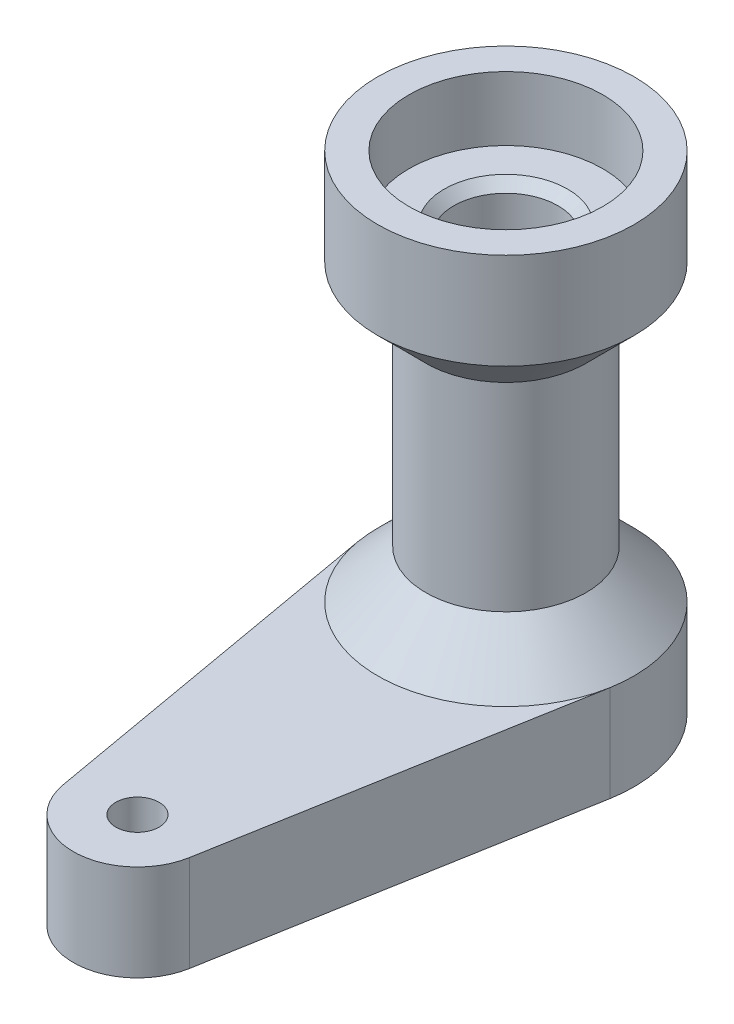
ISO-10303-21;
HEADER;
FILE_DESCRIPTION(('STEP AP214'),'2;1');
FILE_NAME('part.step','',(''),(''),'','','');
FILE_SCHEMA(('AUTOMOTIVE_DESIGN { 1 0 10303 214 1 1 1 1 }'));
ENDSEC;
DATA;
#1=APPLICATION_CONTEXT('core data for automotive mechanical design processes');
#2=APPLICATION_PROTOCOL_DEFINITION('international standard','automotive_design',2000,#1);
#3=PRODUCT_CONTEXT('',#1,'mechanical');
#4=PRODUCT('Part','Part','',(#3));
#5=PRODUCT_RELATED_PRODUCT_CATEGORY('part','',(#4));
#6=PRODUCT_DEFINITION_FORMATION('','',#4);
#7=PRODUCT_DEFINITION_CONTEXT('part definition',#1,'design');
#8=PRODUCT_DEFINITION('design','',#6,#7);
#9=PRODUCT_DEFINITION_SHAPE('','',#8);
#10=(LENGTH_UNIT() NAMED_UNIT(*) SI_UNIT(.MILLI.,.METRE.));
#11=(NAMED_UNIT(*) PLANE_ANGLE_UNIT() SI_UNIT($,.RADIAN.));
#12=(NAMED_UNIT(*) SI_UNIT($,.STERADIAN.) SOLID_ANGLE_UNIT());
#13=UNCERTAINTY_MEASURE_WITH_UNIT(LENGTH_MEASURE(1.E-05),#10,'distance_accuracy_value','');
#14=(GEOMETRIC_REPRESENTATION_CONTEXT(3) GLOBAL_UNCERTAINTY_ASSIGNED_CONTEXT((#13)) GLOBAL_UNIT_ASSIGNED_CONTEXT((#10,
#11,#12)) REPRESENTATION_CONTEXT('',''));
#15=CARTESIAN_POINT('',(0.,0.,0.));
#16=DIRECTION('',(0.,0.,1.));
#17=DIRECTION('',(1.,0.,0.));
#18=AXIS2_PLACEMENT_3D('',#15,#16,#17);
#19=CARTESIAN_POINT('',(-7.99999999999998,0.,0.));
#20=DIRECTION('',(0.,1.,0.));
#21=DIRECTION('',(0.,0.,1.));
#22=AXIS2_PLACEMENT_3D('',#19,#20,#21);
#23=PLANE('',#22);
#24=CARTESIAN_POINT('',(0.,0.,0.));
#25=DIRECTION('',(0.,-1.,0.));
#26=DIRECTION('',(0.,0.,-1.));
#27=AXIS2_PLACEMENT_3D('',#24,#25,#26);
#28=CIRCLE('',#27,6.04999999999997);
#29=CARTESIAN_POINT('',(0.,0.,-6.04999999999997));
#30=VERTEX_POINT('',#29);
#31=EDGE_CURVE('E11',#30,#30,#28,.T.);
#32=ORIENTED_EDGE('',*,*,#31,.F.);
#33=EDGE_LOOP('',(#32));
#34=FACE_BOUND('',#33,.T.);
#35=CARTESIAN_POINT('',(0.,0.,0.));
#36=DIRECTION('',(0.,-1.,0.));
#37=DIRECTION('',(0.,0.,-1.));
#38=AXIS2_PLACEMENT_3D('',#35,#36,#37);
#39=CIRCLE('',#38,7.99999999999998);
#40=CARTESIAN_POINT('',(-7.87808810636948,0.,1.39130434782608));
#41=VERTEX_POINT('',#40);
#42=CARTESIAN_POINT('',(7.87808810636946,0.,1.39130434782608));
#43=VERTEX_POINT('',#42);
#44=EDGE_CURVE('E107',#41,#43,#39,.T.);
#45=ORIENTED_EDGE('',*,*,#44,.T.);
#46=DIRECTION('',(0.173913043478261,0.,-0.984761013296185));
#47=VECTOR('',#46,1.);
#48=CARTESIAN_POINT('',(3.93904405318474,0.,23.695652173913));
#49=LINE('',#48,#47);
#50=CARTESIAN_POINT('',(3.93904405318474,0.,23.695652173913));
#51=VERTEX_POINT('',#50);
#52=EDGE_CURVE('E189',#51,#43,#49,.T.);
#53=ORIENTED_EDGE('',*,*,#52,.F.);
#54=CARTESIAN_POINT('',(0.,0.,23.));
#55=DIRECTION('',(0.,1.,0.));
#56=DIRECTION('',(0.,0.,-1.));
#57=AXIS2_PLACEMENT_3D('',#54,#55,#56);
#58=CIRCLE('',#57,4.);
#59=CARTESIAN_POINT('',(-3.93904405318474,0.,23.695652173913));
#60=VERTEX_POINT('',#59);
#61=EDGE_CURVE('E105',#60,#51,#58,.T.);
#62=ORIENTED_EDGE('',*,*,#61,.F.);
#63=DIRECTION('',(0.173913043478261,0.,0.984761013296185));
#64=VECTOR('',#63,1.);
#65=CARTESIAN_POINT('',(-7.87808810636948,0.,1.39130434782609));
#66=LINE('',#65,#64);
#67=EDGE_CURVE('E101',#41,#60,#66,.T.);
#68=ORIENTED_EDGE('',*,*,#67,.F.);
#69=EDGE_LOOP('',(#45,#53,#62,#68));
#70=FACE_BOUND('',#69,.T.);
#71=CARTESIAN_POINT('',(0.,0.,23.));
#72=DIRECTION('',(0.,1.,0.));
#73=DIRECTION('',(0.,0.,1.));
#74=AXIS2_PLACEMENT_3D('',#71,#72,#73);
#75=CIRCLE('',#74,1.35);
#76=CARTESIAN_POINT('',(0.,0.,24.35));
#77=VERTEX_POINT('',#76);
#78=EDGE_CURVE('E175',#77,#77,#75,.T.);
#79=ORIENTED_EDGE('',*,*,#78,.T.);
#80=EDGE_LOOP('',(#79));
#81=FACE_BOUND('',#80,.T.);
#82=ADVANCED_FACE('F39',(#34,#70,#81),#23,.F.);
#83=CARTESIAN_POINT('',(0.,-1.14422068437634,0.));
#84=DIRECTION('',(0.,-1.,0.));
#85=DIRECTION('',(0.,0.,-1.));
#86=AXIS2_PLACEMENT_3D('',#83,#84,#85);
#87=CYLINDRICAL_SURFACE('',#86,6.04999999999997);
#88=CARTESIAN_POINT('',(0.,4.,0.));
#89=DIRECTION('',(0.,-1.,0.));
#90=DIRECTION('',(0.,0.,-1.));
#91=AXIS2_PLACEMENT_3D('',#88,#89,#90);
#92=CIRCLE('',#91,6.04999999999997);
#93=CARTESIAN_POINT('',(0.,4.,-6.04999999999997));
#94=VERTEX_POINT('',#93);
#95=EDGE_CURVE('E47',#94,#94,#92,.T.);
#96=ORIENTED_EDGE('',*,*,#95,.F.);
#97=EDGE_LOOP('',(#96));
#98=FACE_BOUND('',#97,.T.);
#99=ORIENTED_EDGE('',*,*,#31,.T.);
#100=EDGE_LOOP('',(#99));
#101=FACE_BOUND('',#100,.T.);
#102=ADVANCED_FACE('F164',(#98,#101),#87,.F.);
#103=CARTESIAN_POINT('',(-6.04999999999997,4.,0.));
#104=DIRECTION('',(0.,1.,0.));
#105=DIRECTION('',(0.,0.,1.));
#106=AXIS2_PLACEMENT_3D('',#103,#104,#105);
#107=PLANE('',#106);
#108=CARTESIAN_POINT('',(0.,4.,0.));
#109=DIRECTION('',(0.,-1.,0.));
#110=DIRECTION('',(0.,0.,-1.));
#111=AXIS2_PLACEMENT_3D('',#108,#109,#110);
#112=CIRCLE('',#111,3.85);
#113=CARTESIAN_POINT('',(0.,4.,-3.85));
#114=VERTEX_POINT('',#113);
#115=EDGE_CURVE('E155',#114,#114,#112,.T.);
#116=ORIENTED_EDGE('',*,*,#115,.F.);
#117=EDGE_LOOP('',(#116));
#118=FACE_BOUND('',#117,.T.);
#119=ORIENTED_EDGE('',*,*,#95,.T.);
#120=EDGE_LOOP('',(#119));
#121=FACE_BOUND('',#120,.T.);
#122=ADVANCED_FACE('F162',(#118,#121),#107,.F.);
#123=CARTESIAN_POINT('',(0.,4.,0.));
#124=DIRECTION('',(0.,-1.,0.));
#125=DIRECTION('',(0.,0.,-1.));
#126=AXIS2_PLACEMENT_3D('',#123,#124,#125);
#127=CONICAL_SURFACE('',#126,3.85,0.785398163397448);
#128=CARTESIAN_POINT('',(0.,4.6,0.));
#129=DIRECTION('',(0.,-1.,0.));
#130=DIRECTION('',(0.,0.,-1.));
#131=AXIS2_PLACEMENT_3D('',#128,#129,#130);
#132=CIRCLE('',#131,3.25);
#133=CARTESIAN_POINT('',(0.,4.6,-3.25));
#134=VERTEX_POINT('',#133);
#135=EDGE_CURVE('E151',#134,#134,#132,.T.);
#136=ORIENTED_EDGE('',*,*,#135,.F.);
#137=EDGE_LOOP('',(#136));
#138=FACE_BOUND('',#137,.T.);
#139=ORIENTED_EDGE('',*,*,#115,.T.);
#140=EDGE_LOOP('',(#139));
#141=FACE_BOUND('',#140,.T.);
#142=ADVANCED_FACE('F250',(#138,#141),#127,.F.);
#143=CARTESIAN_POINT('',(0.,-1.14422068437634,0.));
#144=DIRECTION('',(0.,-1.,0.));
#145=DIRECTION('',(0.,0.,-1.));
#146=AXIS2_PLACEMENT_3D('',#143,#144,#145);
#147=CYLINDRICAL_SURFACE('',#146,3.25);
#148=CARTESIAN_POINT('',(0.,25.8,0.));
#149=DIRECTION('',(0.,-1.,0.));
#150=DIRECTION('',(0.,0.,-1.));
#151=AXIS2_PLACEMENT_3D('',#148,#149,#150);
#152=CIRCLE('',#151,3.25);
#153=CARTESIAN_POINT('',(0.,25.8,-3.25));
#154=VERTEX_POINT('',#153);
#155=EDGE_CURVE('E147',#154,#154,#152,.T.);
#156=ORIENTED_EDGE('',*,*,#155,.F.);
#157=EDGE_LOOP('',(#156));
#158=FACE_BOUND('',#157,.T.);
#159=ORIENTED_EDGE('',*,*,#135,.T.);
#160=EDGE_LOOP('',(#159));
#161=FACE_BOUND('',#160,.T.);
#162=ADVANCED_FACE('F246',(#158,#161),#147,.F.);
#163=CARTESIAN_POINT('',(0.,25.8,0.));
#164=DIRECTION('',(0.,1.,0.));
#165=DIRECTION('',(0.,0.,1.));
#166=AXIS2_PLACEMENT_3D('',#163,#164,#165);
#167=CONICAL_SURFACE('',#166,3.25,0.785398163397449);
#168=CARTESIAN_POINT('',(0.,26.4,0.));
#169=DIRECTION('',(0.,-1.,0.));
#170=DIRECTION('',(0.,0.,-1.));
#171=AXIS2_PLACEMENT_3D('',#168,#169,#170);
#172=CIRCLE('',#171,3.85);
#173=CARTESIAN_POINT('',(0.,26.4,-3.85));
#174=VERTEX_POINT('',#173);
#175=EDGE_CURVE('E143',#174,#174,#172,.T.);
#176=ORIENTED_EDGE('',*,*,#175,.F.);
#177=EDGE_LOOP('',(#176));
#178=FACE_BOUND('',#177,.T.);
#179=ORIENTED_EDGE('',*,*,#155,.T.);
#180=EDGE_LOOP('',(#179));
#181=FACE_BOUND('',#180,.T.);
#182=ADVANCED_FACE('F242',(#178,#181),#167,.F.);
#183=CARTESIAN_POINT('',(-3.85,26.4,0.));
#184=DIRECTION('',(0.,-1.,0.));
#185=DIRECTION('',(0.,0.,-1.));
#186=AXIS2_PLACEMENT_3D('',#183,#184,#185);
#187=PLANE('',#186);
#188=CARTESIAN_POINT('',(0.,26.4,0.));
#189=DIRECTION('',(0.,-1.,0.));
#190=DIRECTION('',(0.,0.,-1.));
#191=AXIS2_PLACEMENT_3D('',#188,#189,#190);
#192=CIRCLE('',#191,6.05);
#193=CARTESIAN_POINT('',(0.,26.4,-6.05));
#194=VERTEX_POINT('',#193);
#195=EDGE_CURVE('E139',#194,#194,#192,.T.);
#196=ORIENTED_EDGE('',*,*,#195,.F.);
#197=EDGE_LOOP('',(#196));
#198=FACE_BOUND('',#197,.T.);
#199=ORIENTED_EDGE('',*,*,#175,.T.);
#200=EDGE_LOOP('',(#199));
#201=FACE_BOUND('',#200,.T.);
#202=ADVANCED_FACE('F238',(#198,#201),#187,.F.);
#203=CARTESIAN_POINT('',(0.,-1.14422068437634,0.));
#204=DIRECTION('',(0.,-1.,0.));
#205=DIRECTION('',(0.,0.,-1.));
#206=AXIS2_PLACEMENT_3D('',#203,#204,#205);
#207=CYLINDRICAL_SURFACE('',#206,6.05);
#208=CARTESIAN_POINT('',(0.,30.4,0.));
#209=DIRECTION('',(0.,-1.,0.));
#210=DIRECTION('',(0.,0.,-1.));
#211=AXIS2_PLACEMENT_3D('',#208,#209,#210);
#212=CIRCLE('',#211,6.05);
#213=CARTESIAN_POINT('',(0.,30.4,-6.05));
#214=VERTEX_POINT('',#213);
#215=EDGE_CURVE('E135',#214,#214,#212,.T.);
#216=ORIENTED_EDGE('',*,*,#215,.F.);
#217=EDGE_LOOP('',(#216));
#218=FACE_BOUND('',#217,.T.);
#219=ORIENTED_EDGE('',*,*,#195,.T.);
#220=EDGE_LOOP('',(#219));
#221=FACE_BOUND('',#220,.T.);
#222=ADVANCED_FACE('F234',(#218,#221),#207,.F.);
#223=CARTESIAN_POINT('',(-6.05,30.4,0.));
#224=DIRECTION('',(0.,-1.,0.));
#225=DIRECTION('',(0.,0.,-1.));
#226=AXIS2_PLACEMENT_3D('',#223,#224,#225);
#227=PLANE('',#226);
#228=CARTESIAN_POINT('',(0.,30.4,0.));
#229=DIRECTION('',(0.,-1.,0.));
#230=DIRECTION('',(0.,0.,-1.));
#231=AXIS2_PLACEMENT_3D('',#228,#229,#230);
#232=CIRCLE('',#231,8.00000000000001);
#233=CARTESIAN_POINT('',(0.,30.4,-8.00000000000001));
#234=VERTEX_POINT('',#233);
#235=EDGE_CURVE('E131',#234,#234,#232,.T.);
#236=ORIENTED_EDGE('',*,*,#235,.F.);
#237=EDGE_LOOP('',(#236));
#238=FACE_BOUND('',#237,.T.);
#239=ORIENTED_EDGE('',*,*,#215,.T.);
#240=EDGE_LOOP('',(#239));
#241=FACE_BOUND('',#240,.T.);
#242=ADVANCED_FACE('F230',(#238,#241),#227,.F.);
#243=CARTESIAN_POINT('',(0.,-1.14422068437634,0.));
#244=DIRECTION('',(0.,-1.,0.));
#245=DIRECTION('',(0.,0.,-1.));
#246=AXIS2_PLACEMENT_3D('',#243,#244,#245);
#247=CYLINDRICAL_SURFACE('',#246,8.00000000000001);
#248=CARTESIAN_POINT('',(0.,24.4,0.));
#249=DIRECTION('',(0.,-1.,0.));
#250=DIRECTION('',(0.,0.,-1.));
#251=AXIS2_PLACEMENT_3D('',#248,#249,#250);
#252=CIRCLE('',#251,8.);
#253=CARTESIAN_POINT('',(0.,24.4,-8.));
#254=VERTEX_POINT('',#253);
#255=EDGE_CURVE('E127',#254,#254,#252,.T.);
#256=ORIENTED_EDGE('',*,*,#255,.F.);
#257=EDGE_LOOP('',(#256));
#258=FACE_BOUND('',#257,.T.);
#259=ORIENTED_EDGE('',*,*,#235,.T.);
#260=EDGE_LOOP('',(#259));
#261=FACE_BOUND('',#260,.T.);
#262=ADVANCED_FACE('F226',(#258,#261),#247,.T.);
#263=CARTESIAN_POINT('',(0.,24.4,0.));
#264=DIRECTION('',(0.,1.,0.));
#265=DIRECTION('',(0.,0.,1.));
#266=AXIS2_PLACEMENT_3D('',#263,#264,#265);
#267=CONICAL_SURFACE('',#266,8.,0.785398163397447);
#268=CARTESIAN_POINT('',(0.,21.4,0.));
#269=DIRECTION('',(0.,-1.,0.));
#270=DIRECTION('',(0.,0.,-1.));
#271=AXIS2_PLACEMENT_3D('',#268,#269,#270);
#272=CIRCLE('',#271,5.);
#273=CARTESIAN_POINT('',(0.,21.4,-5.));
#274=VERTEX_POINT('',#273);
#275=EDGE_CURVE('E123',#274,#274,#272,.T.);
#276=ORIENTED_EDGE('',*,*,#275,.F.);
#277=EDGE_LOOP('',(#276));
#278=FACE_BOUND('',#277,.T.);
#279=ORIENTED_EDGE('',*,*,#255,.T.);
#280=EDGE_LOOP('',(#279));
#281=FACE_BOUND('',#280,.T.);
#282=ADVANCED_FACE('F222',(#278,#281),#267,.T.);
#283=CARTESIAN_POINT('',(0.,-1.14422068437634,0.));
#284=DIRECTION('',(0.,-1.,0.));
#285=DIRECTION('',(0.,0.,-1.));
#286=AXIS2_PLACEMENT_3D('',#283,#284,#285);
#287=CYLINDRICAL_SURFACE('',#286,4.99999999999999);
#288=CARTESIAN_POINT('',(0.,9.00000000000004,0.));
#289=DIRECTION('',(0.,-1.,0.));
#290=DIRECTION('',(0.,0.,-1.));
#291=AXIS2_PLACEMENT_3D('',#288,#289,#290);
#292=CIRCLE('',#291,4.99999999999998);
#293=CARTESIAN_POINT('',(0.,9.00000000000004,-4.99999999999998));
#294=VERTEX_POINT('',#293);
#295=EDGE_CURVE('E119',#294,#294,#292,.T.);
#296=ORIENTED_EDGE('',*,*,#295,.F.);
#297=EDGE_LOOP('',(#296));
#298=FACE_BOUND('',#297,.T.);
#299=ORIENTED_EDGE('',*,*,#275,.T.);
#300=EDGE_LOOP('',(#299));
#301=FACE_BOUND('',#300,.T.);
#302=ADVANCED_FACE('F218',(#298,#301),#287,.T.);
#303=CARTESIAN_POINT('',(0.,9.00000000000004,0.));
#304=DIRECTION('',(0.,-1.,0.));
#305=DIRECTION('',(0.,0.,-1.));
#306=AXIS2_PLACEMENT_3D('',#303,#304,#305);
#307=CONICAL_SURFACE('',#306,4.99999999999998,0.785398163397448);
#308=CARTESIAN_POINT('',(0.,6.00000000000003,0.));
#309=DIRECTION('',(0.,-1.,0.));
#310=DIRECTION('',(0.,0.,-1.));
#311=AXIS2_PLACEMENT_3D('',#308,#309,#310);
#312=CIRCLE('',#311,7.99999999999999);
#313=CARTESIAN_POINT('',(7.87808810636947,6.00000000000003,1.39130434782609));
#314=VERTEX_POINT('',#313);
#315=CARTESIAN_POINT('',(-7.87808810636947,6.00000000000003,1.39130434782609));
#316=VERTEX_POINT('',#315);
#317=EDGE_CURVE('E116',#314,#316,#312,.T.);
#318=ORIENTED_EDGE('',*,*,#317,.F.);
#319=EDGE_CURVE('E58',#316,#314,#312,.T.);
#320=ORIENTED_EDGE('',*,*,#319,.F.);
#321=EDGE_LOOP('',(#318,#320));
#322=FACE_BOUND('',#321,.T.);
#323=ORIENTED_EDGE('',*,*,#295,.T.);
#324=EDGE_LOOP('',(#323));
#325=FACE_BOUND('',#324,.T.);
#326=ADVANCED_FACE('F215',(#322,#325),#307,.T.);
#327=CARTESIAN_POINT('',(0.,-1.14422068437634,0.));
#328=DIRECTION('',(0.,-1.,0.));
#329=DIRECTION('',(0.,0.,-1.));
#330=AXIS2_PLACEMENT_3D('',#327,#328,#329);
#331=CYLINDRICAL_SURFACE('',#330,7.99999999999999);
#332=ORIENTED_EDGE('',*,*,#319,.T.);
#333=DIRECTION('',(0.,-1.,0.));
#334=VECTOR('',#333,1.);
#335=CARTESIAN_POINT('',(7.87808810636948,6.00000000000003,1.39130434782609));
#336=LINE('',#335,#334);
#337=EDGE_CURVE('E86',#314,#43,#336,.T.);
#338=ORIENTED_EDGE('',*,*,#337,.T.);
#339=ORIENTED_EDGE('',*,*,#44,.F.);
#340=DIRECTION('',(0.,-1.,0.));
#341=VECTOR('',#340,1.);
#342=CARTESIAN_POINT('',(-7.87808810636948,6.00000000000003,1.39130434782608));
#343=LINE('',#342,#341);
#344=EDGE_CURVE('E54',#316,#41,#343,.T.);
#345=ORIENTED_EDGE('',*,*,#344,.F.);
#346=EDGE_LOOP('',(#332,#338,#339,#345));
#347=FACE_BOUND('',#346,.T.);
#348=ADVANCED_FACE('F212',(#347),#331,.T.);
#349=CARTESIAN_POINT('',(0.,6.00000000000003,23.));
#350=DIRECTION('',(0.,-1.,0.));
#351=DIRECTION('',(0.,0.,-1.));
#352=AXIS2_PLACEMENT_3D('',#349,#350,#351);
#353=PLANE('',#352);
#354=CARTESIAN_POINT('',(0.,6.00000000000003,23.));
#355=DIRECTION('',(0.,1.,0.));
#356=DIRECTION('',(0.,0.,-1.));
#357=AXIS2_PLACEMENT_3D('',#354,#355,#356);
#358=CIRCLE('',#357,4.);
#359=CARTESIAN_POINT('',(-3.93904405318474,6.00000000000003,23.695652173913));
#360=VERTEX_POINT('',#359);
#361=CARTESIAN_POINT('',(3.93904405318474,6.00000000000003,23.695652173913));
#362=VERTEX_POINT('',#361);
#363=EDGE_CURVE('E91',#360,#362,#358,.T.);
#364=ORIENTED_EDGE('',*,*,#363,.T.);
#365=DIRECTION('',(0.173913043478261,0.,-0.984761013296185));
#366=VECTOR('',#365,1.);
#367=CARTESIAN_POINT('',(3.93904405318474,6.00000000000003,23.695652173913));
#368=LINE('',#367,#366);
#369=EDGE_CURVE('E79',#362,#314,#368,.T.);
#370=ORIENTED_EDGE('',*,*,#369,.T.);
#371=ORIENTED_EDGE('',*,*,#317,.T.);
#372=DIRECTION('',(0.173913043478261,0.,0.984761013296185));
#373=VECTOR('',#372,1.);
#374=CARTESIAN_POINT('',(-7.87808810636948,6.00000000000003,1.39130434782609));
#375=LINE('',#374,#373);
#376=EDGE_CURVE('E90',#316,#360,#375,.T.);
#377=ORIENTED_EDGE('',*,*,#376,.T.);
#378=EDGE_LOOP('',(#364,#370,#371,#377));
#379=FACE_BOUND('',#378,.T.);
#380=CARTESIAN_POINT('',(0.,6.00000000000003,23.));
#381=DIRECTION('',(0.,1.,0.));
#382=DIRECTION('',(0.,0.,1.));
#383=AXIS2_PLACEMENT_3D('',#380,#381,#382);
#384=CIRCLE('',#383,1.35);
#385=CARTESIAN_POINT('',(0.,6.00000000000003,24.35));
#386=VERTEX_POINT('',#385);
#387=EDGE_CURVE('E178',#386,#386,#384,.T.);
#388=ORIENTED_EDGE('',*,*,#387,.F.);
#389=EDGE_LOOP('',(#388));
#390=FACE_BOUND('',#389,.T.);
#391=ADVANCED_FACE('F94',(#379,#390),#353,.F.);
#392=CARTESIAN_POINT('',(0.,6.00000000000003,23.));
#393=DIRECTION('',(0.,-1.,0.));
#394=DIRECTION('',(0.,0.,-1.));
#395=AXIS2_PLACEMENT_3D('',#392,#393,#394);
#396=CYLINDRICAL_SURFACE('',#395,4.);
#397=ORIENTED_EDGE('',*,*,#61,.T.);
#398=DIRECTION('',(0.,-1.,0.));
#399=VECTOR('',#398,1.);
#400=CARTESIAN_POINT('',(3.93904405318474,6.00000000000003,23.695652173913));
#401=LINE('',#400,#399);
#402=EDGE_CURVE('E84',#362,#51,#401,.T.);
#403=ORIENTED_EDGE('',*,*,#402,.F.);
#404=ORIENTED_EDGE('',*,*,#363,.F.);
#405=DIRECTION('',(0.,-1.,0.));
#406=VECTOR('',#405,1.);
#407=CARTESIAN_POINT('',(-3.93904405318474,6.00000000000003,23.695652173913));
#408=LINE('',#407,#406);
#409=EDGE_CURVE('E186',#360,#60,#408,.T.);
#410=ORIENTED_EDGE('',*,*,#409,.T.);
#411=EDGE_LOOP('',(#397,#403,#404,#410));
#412=FACE_BOUND('',#411,.T.);
#413=ADVANCED_FACE('F103',(#412),#396,.T.);
#414=CARTESIAN_POINT('',(3.93904405318474,6.00000000000003,23.695652173913));
#415=DIRECTION('',(-0.984761013296185,0.,-0.173913043478261));
#416=DIRECTION('',(-0.173913043478261,0.,0.984761013296185));
#417=AXIS2_PLACEMENT_3D('',#414,#415,#416);
#418=PLANE('',#417);
#419=ORIENTED_EDGE('',*,*,#52,.T.);
#420=ORIENTED_EDGE('',*,*,#337,.F.);
#421=ORIENTED_EDGE('',*,*,#369,.F.);
#422=ORIENTED_EDGE('',*,*,#402,.T.);
#423=EDGE_LOOP('',(#419,#420,#421,#422));
#424=FACE_BOUND('',#423,.T.);
#425=ADVANCED_FACE('F82',(#424),#418,.F.);
#426=CARTESIAN_POINT('',(-7.87808810636948,6.00000000000003,1.39130434782609));
#427=DIRECTION('',(0.984761013296185,0.,-0.173913043478261));
#428=DIRECTION('',(-0.173913043478261,0.,-0.984761013296185));
#429=AXIS2_PLACEMENT_3D('',#426,#427,#428);
#430=PLANE('',#429);
#431=ORIENTED_EDGE('',*,*,#67,.T.);
#432=ORIENTED_EDGE('',*,*,#409,.F.);
#433=ORIENTED_EDGE('',*,*,#376,.F.);
#434=ORIENTED_EDGE('',*,*,#344,.T.);
#435=EDGE_LOOP('',(#431,#432,#433,#434));
#436=FACE_BOUND('',#435,.T.);
#437=ADVANCED_FACE('F197',(#436),#430,.F.);
#438=CARTESIAN_POINT('',(0.,6.00000000000003,23.));
#439=DIRECTION('',(0.,-1.,0.));
#440=DIRECTION('',(0.,0.,-1.));
#441=AXIS2_PLACEMENT_3D('',#438,#439,#440);
#442=CYLINDRICAL_SURFACE('',#441,1.35);
#443=ORIENTED_EDGE('',*,*,#387,.T.);
#444=EDGE_LOOP('',(#443));
#445=FACE_BOUND('',#444,.T.);
#446=ORIENTED_EDGE('',*,*,#78,.F.);
#447=EDGE_LOOP('',(#446));
#448=FACE_BOUND('',#447,.T.);
#449=ADVANCED_FACE('F199',(#445,#448),#442,.F.);
#450=CLOSED_SHELL('',(#82,#102,#122,#142,#162,#182,#202,#222,#242,#262,#282,#302,#326,#348,#391,
#413,#425,#437,#449));
#451=MANIFOLD_SOLID_BREP('B2',#450);
#452=ADVANCED_BREP_SHAPE_REPRESENTATION('',(#18,#451),#14);
#453=SHAPE_DEFINITION_REPRESENTATION(#9,#452);
ENDSEC;
END-ISO-10303-21;
